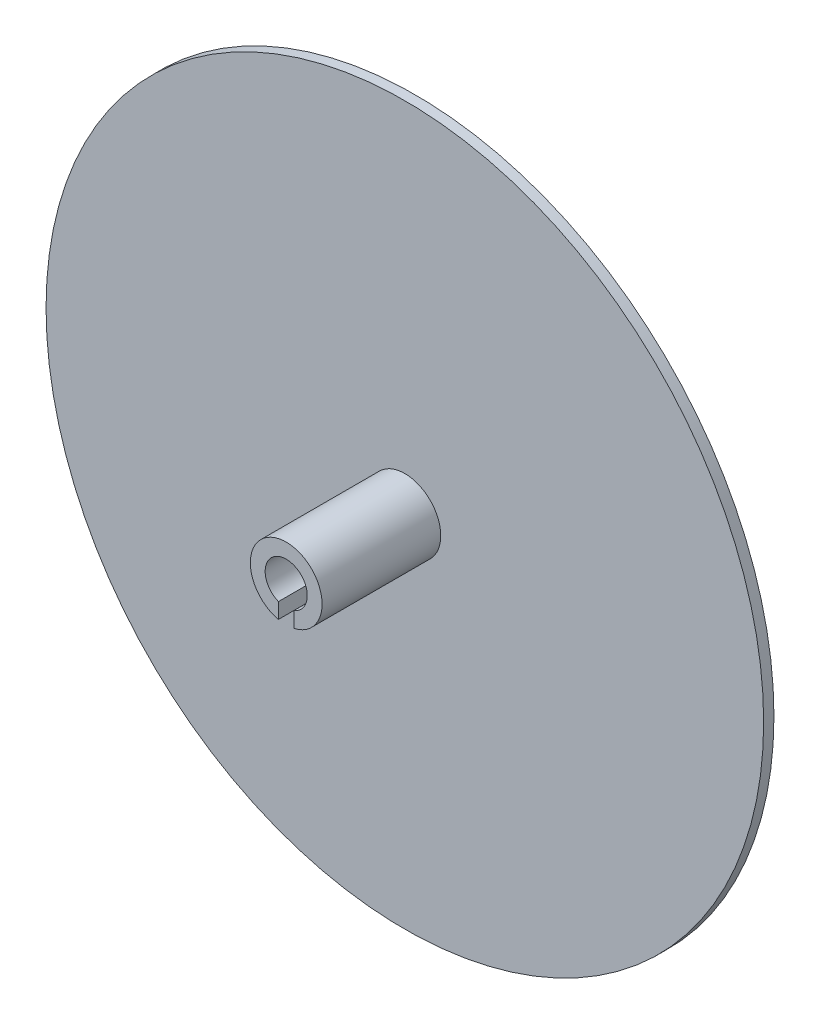
ISO-10303-21;
HEADER;
FILE_DESCRIPTION(('STEP AP214'),'2;1');
FILE_NAME('part.step','',(''),(''),'','','');
FILE_SCHEMA(('AUTOMOTIVE_DESIGN { 1 0 10303 214 1 1 1 1 }'));
ENDSEC;
DATA;
#1=APPLICATION_CONTEXT('core data for automotive mechanical design processes');
#2=APPLICATION_PROTOCOL_DEFINITION('international standard','automotive_design',2000,#1);
#3=PRODUCT_CONTEXT('',#1,'mechanical');
#4=PRODUCT('Part','Part','',(#3));
#5=PRODUCT_RELATED_PRODUCT_CATEGORY('part','',(#4));
#6=PRODUCT_DEFINITION_FORMATION('','',#4);
#7=PRODUCT_DEFINITION_CONTEXT('part definition',#1,'design');
#8=PRODUCT_DEFINITION('design','',#6,#7);
#9=PRODUCT_DEFINITION_SHAPE('','',#8);
#10=(LENGTH_UNIT() NAMED_UNIT(*) SI_UNIT(.MILLI.,.METRE.));
#11=(NAMED_UNIT(*) PLANE_ANGLE_UNIT() SI_UNIT($,.RADIAN.));
#12=(NAMED_UNIT(*) SI_UNIT($,.STERADIAN.) SOLID_ANGLE_UNIT());
#13=UNCERTAINTY_MEASURE_WITH_UNIT(LENGTH_MEASURE(1.E-05),#10,'distance_accuracy_value','');
#14=(GEOMETRIC_REPRESENTATION_CONTEXT(3) GLOBAL_UNCERTAINTY_ASSIGNED_CONTEXT((#13)) GLOBAL_UNIT_ASSIGNED_CONTEXT((#10,
#11,#12)) REPRESENTATION_CONTEXT('',''));
#15=CARTESIAN_POINT('',(0.,0.,0.));
#16=DIRECTION('',(0.,0.,1.));
#17=DIRECTION('',(1.,0.,0.));
#18=AXIS2_PLACEMENT_3D('',#15,#16,#17);
#19=CARTESIAN_POINT('',(0.,0.,53.9));
#20=DIRECTION('',(0.,0.,1.));
#21=DIRECTION('',(1.,0.,0.));
#22=AXIS2_PLACEMENT_3D('',#19,#20,#21);
#23=PLANE('',#22);
#24=CARTESIAN_POINT('',(0.,0.,53.9));
#25=DIRECTION('',(0.,0.,1.));
#26=DIRECTION('',(1.,0.,0.));
#27=AXIS2_PLACEMENT_3D('',#24,#25,#26);
#28=CIRCLE('',#27,15.);
#29=CARTESIAN_POINT('',(3.25,-14.6436846456075,53.9));
#30=VERTEX_POINT('',#29);
#31=CARTESIAN_POINT('',(-3.25,-14.6436846456075,53.9));
#32=VERTEX_POINT('',#31);
#33=EDGE_CURVE('E107',#30,#32,#28,.T.);
#34=ORIENTED_EDGE('',*,*,#33,.T.);
#35=DIRECTION('',(0.,1.,0.));
#36=VECTOR('',#35,1.);
#37=CARTESIAN_POINT('',(-3.25,0.,53.9));
#38=LINE('',#37,#36);
#39=CARTESIAN_POINT('',(-3.25,-8.17786646992967,53.9));
#40=VERTEX_POINT('',#39);
#41=EDGE_CURVE('E77',#32,#40,#38,.T.);
#42=ORIENTED_EDGE('',*,*,#41,.T.);
#43=CARTESIAN_POINT('',(0.,0.,53.9));
#44=DIRECTION('',(0.,0.,1.));
#45=DIRECTION('',(1.,0.,0.));
#46=AXIS2_PLACEMENT_3D('',#43,#44,#45);
#47=CIRCLE('',#46,8.8);
#48=CARTESIAN_POINT('',(3.25,-8.17786646992967,53.9));
#49=VERTEX_POINT('',#48);
#50=EDGE_CURVE('E99',#49,#40,#47,.T.);
#51=ORIENTED_EDGE('',*,*,#50,.F.);
#52=DIRECTION('',(0.,1.,0.));
#53=VECTOR('',#52,1.);
#54=CARTESIAN_POINT('',(3.25,0.,53.9));
#55=LINE('',#54,#53);
#56=EDGE_CURVE('E89',#30,#49,#55,.T.);
#57=ORIENTED_EDGE('',*,*,#56,.F.);
#58=EDGE_LOOP('',(#34,#42,#51,#57));
#59=FACE_BOUND('',#58,.T.);
#60=ADVANCED_FACE('F33',(#59),#23,.T.);
#61=CARTESIAN_POINT('',(0.,0.,53.9));
#62=DIRECTION('',(0.,0.,-1.));
#63=DIRECTION('',(-1.,0.,0.));
#64=AXIS2_PLACEMENT_3D('',#61,#62,#63);
#65=CYLINDRICAL_SURFACE('',#64,15.);
#66=CARTESIAN_POINT('',(0.,0.,4.3));
#67=DIRECTION('',(0.,0.,1.));
#68=DIRECTION('',(1.,0.,0.));
#69=AXIS2_PLACEMENT_3D('',#66,#67,#68);
#70=CIRCLE('',#69,15.);
#71=CARTESIAN_POINT('',(15.,0.,4.3));
#72=VERTEX_POINT('',#71);
#73=EDGE_CURVE('E106',#72,#72,#70,.T.);
#74=ORIENTED_EDGE('',*,*,#73,.T.);
#75=EDGE_LOOP('',(#74));
#76=FACE_BOUND('',#75,.T.);
#77=DIRECTION('',(0.,0.,1.));
#78=VECTOR('',#77,1.);
#79=CARTESIAN_POINT('',(-3.25,-14.6436846456075,36.65));
#80=LINE('',#79,#78);
#81=CARTESIAN_POINT('',(-3.25,-14.6436846456075,36.65));
#82=VERTEX_POINT('',#81);
#83=EDGE_CURVE('E75',#82,#32,#80,.T.);
#84=ORIENTED_EDGE('',*,*,#83,.T.);
#85=ORIENTED_EDGE('',*,*,#33,.F.);
#86=DIRECTION('',(0.,0.,1.));
#87=VECTOR('',#86,1.);
#88=CARTESIAN_POINT('',(3.25,-14.6436846456075,36.65));
#89=LINE('',#88,#87);
#90=CARTESIAN_POINT('',(3.25,-14.6436846456075,36.65));
#91=VERTEX_POINT('',#90);
#92=EDGE_CURVE('E82',#91,#30,#89,.T.);
#93=ORIENTED_EDGE('',*,*,#92,.F.);
#94=CARTESIAN_POINT('',(0.,0.,36.65));
#95=DIRECTION('',(0.,0.,1.));
#96=DIRECTION('',(1.,0.,0.));
#97=AXIS2_PLACEMENT_3D('',#94,#95,#96);
#98=CIRCLE('',#97,15.);
#99=EDGE_CURVE('E86',#82,#91,#98,.T.);
#100=ORIENTED_EDGE('',*,*,#99,.F.);
#101=EDGE_LOOP('',(#84,#85,#93,#100));
#102=FACE_BOUND('',#101,.T.);
#103=ADVANCED_FACE('F91',(#76,#102),#65,.T.);
#104=CARTESIAN_POINT('',(0.,0.,53.9));
#105=DIRECTION('',(0.,0.,-1.));
#106=DIRECTION('',(-1.,0.,0.));
#107=AXIS2_PLACEMENT_3D('',#104,#105,#106);
#108=CYLINDRICAL_SURFACE('',#107,8.8);
#109=CARTESIAN_POINT('',(0.,0.,4.3));
#110=DIRECTION('',(0.,0.,1.));
#111=DIRECTION('',(1.,0.,0.));
#112=AXIS2_PLACEMENT_3D('',#109,#110,#111);
#113=CIRCLE('',#112,8.8);
#114=CARTESIAN_POINT('',(8.8,0.,4.3));
#115=VERTEX_POINT('',#114);
#116=EDGE_CURVE('E11',#115,#115,#113,.F.);
#117=ORIENTED_EDGE('',*,*,#116,.T.);
#118=EDGE_LOOP('',(#117));
#119=FACE_BOUND('',#118,.T.);
#120=ORIENTED_EDGE('',*,*,#50,.T.);
#121=DIRECTION('',(0.,0.,1.));
#122=VECTOR('',#121,1.);
#123=CARTESIAN_POINT('',(-3.25,-8.17786646992967,36.65));
#124=LINE('',#123,#122);
#125=CARTESIAN_POINT('',(-3.25,-8.17786646992967,36.65));
#126=VERTEX_POINT('',#125);
#127=EDGE_CURVE('E72',#126,#40,#124,.T.);
#128=ORIENTED_EDGE('',*,*,#127,.F.);
#129=CARTESIAN_POINT('',(0.,0.,36.65));
#130=DIRECTION('',(0.,0.,1.));
#131=DIRECTION('',(1.,0.,0.));
#132=AXIS2_PLACEMENT_3D('',#129,#130,#131);
#133=CIRCLE('',#132,8.8);
#134=CARTESIAN_POINT('',(3.25,-8.17786646992967,36.65));
#135=VERTEX_POINT('',#134);
#136=EDGE_CURVE('E83',#135,#126,#133,.F.);
#137=ORIENTED_EDGE('',*,*,#136,.F.);
#138=DIRECTION('',(0.,0.,1.));
#139=VECTOR('',#138,1.);
#140=CARTESIAN_POINT('',(3.25,-8.17786646992967,36.65));
#141=LINE('',#140,#139);
#142=EDGE_CURVE('E100',#135,#49,#141,.T.);
#143=ORIENTED_EDGE('',*,*,#142,.T.);
#144=EDGE_LOOP('',(#120,#128,#137,#143));
#145=FACE_BOUND('',#144,.T.);
#146=ADVANCED_FACE('F134',(#119,#145),#108,.F.);
#147=CARTESIAN_POINT('',(0.,0.,4.3));
#148=DIRECTION('',(0.,0.,-1.));
#149=DIRECTION('',(-1.,0.,0.));
#150=AXIS2_PLACEMENT_3D('',#147,#148,#149);
#151=CYLINDRICAL_SURFACE('',#150,150.);
#152=CARTESIAN_POINT('',(0.,0.,4.3));
#153=DIRECTION('',(0.,0.,1.));
#154=DIRECTION('',(1.,0.,0.));
#155=AXIS2_PLACEMENT_3D('',#152,#153,#154);
#156=CIRCLE('',#155,150.);
#157=CARTESIAN_POINT('',(150.,0.,4.3));
#158=VERTEX_POINT('',#157);
#159=EDGE_CURVE('E41',#158,#158,#156,.T.);
#160=ORIENTED_EDGE('',*,*,#159,.F.);
#161=EDGE_LOOP('',(#160));
#162=FACE_BOUND('',#161,.T.);
#163=CARTESIAN_POINT('',(0.,0.,0.));
#164=DIRECTION('',(0.,0.,1.));
#165=DIRECTION('',(1.,0.,0.));
#166=AXIS2_PLACEMENT_3D('',#163,#164,#165);
#167=CIRCLE('',#166,150.);
#168=CARTESIAN_POINT('',(150.,0.,0.));
#169=VERTEX_POINT('',#168);
#170=EDGE_CURVE('E109',#169,#169,#167,.T.);
#171=ORIENTED_EDGE('',*,*,#170,.T.);
#172=EDGE_LOOP('',(#171));
#173=FACE_BOUND('',#172,.T.);
#174=ADVANCED_FACE('F35',(#162,#173),#151,.T.);
#175=CARTESIAN_POINT('',(0.,0.,4.3));
#176=DIRECTION('',(0.,0.,1.));
#177=DIRECTION('',(1.,0.,0.));
#178=AXIS2_PLACEMENT_3D('',#175,#176,#177);
#179=PLANE('',#178);
#180=ORIENTED_EDGE('',*,*,#73,.F.);
#181=EDGE_LOOP('',(#180));
#182=FACE_BOUND('',#181,.T.);
#183=ORIENTED_EDGE('',*,*,#159,.T.);
#184=EDGE_LOOP('',(#183));
#185=FACE_BOUND('',#184,.T.);
#186=ADVANCED_FACE('F120',(#182,#185),#179,.T.);
#187=CARTESIAN_POINT('',(0.,0.,0.));
#188=DIRECTION('',(0.,0.,1.));
#189=DIRECTION('',(1.,0.,0.));
#190=AXIS2_PLACEMENT_3D('',#187,#188,#189);
#191=PLANE('',#190);
#192=ORIENTED_EDGE('',*,*,#170,.F.);
#193=EDGE_LOOP('',(#192));
#194=FACE_BOUND('',#193,.T.);
#195=ADVANCED_FACE('F117',(#194),#191,.F.);
#196=ORIENTED_EDGE('',*,*,#116,.F.);
#197=EDGE_LOOP('',(#196));
#198=FACE_BOUND('',#197,.T.);
#199=ADVANCED_FACE('F119',(#198),#179,.T.);
#200=CARTESIAN_POINT('',(-3.25,0.,36.65));
#201=DIRECTION('',(1.,0.,0.));
#202=DIRECTION('',(0.,0.,-1.));
#203=AXIS2_PLACEMENT_3D('',#200,#201,#202);
#204=PLANE('',#203);
#205=ORIENTED_EDGE('',*,*,#41,.F.);
#206=ORIENTED_EDGE('',*,*,#83,.F.);
#207=DIRECTION('',(0.,1.,0.));
#208=VECTOR('',#207,1.);
#209=CARTESIAN_POINT('',(-3.25,0.,36.65));
#210=LINE('',#209,#208);
#211=EDGE_CURVE('E57',#82,#126,#210,.T.);
#212=ORIENTED_EDGE('',*,*,#211,.T.);
#213=ORIENTED_EDGE('',*,*,#127,.T.);
#214=EDGE_LOOP('',(#205,#206,#212,#213));
#215=FACE_BOUND('',#214,.T.);
#216=ADVANCED_FACE('F76',(#215),#204,.T.);
#217=CARTESIAN_POINT('',(3.25,0.,36.65));
#218=DIRECTION('',(1.,0.,0.));
#219=DIRECTION('',(0.,0.,-1.));
#220=AXIS2_PLACEMENT_3D('',#217,#218,#219);
#221=PLANE('',#220);
#222=ORIENTED_EDGE('',*,*,#56,.T.);
#223=ORIENTED_EDGE('',*,*,#142,.F.);
#224=DIRECTION('',(0.,1.,0.));
#225=VECTOR('',#224,1.);
#226=CARTESIAN_POINT('',(3.25,0.,36.65));
#227=LINE('',#226,#225);
#228=EDGE_CURVE('E48',#91,#135,#227,.T.);
#229=ORIENTED_EDGE('',*,*,#228,.F.);
#230=ORIENTED_EDGE('',*,*,#92,.T.);
#231=EDGE_LOOP('',(#222,#223,#229,#230));
#232=FACE_BOUND('',#231,.T.);
#233=ADVANCED_FACE('F143',(#232),#221,.F.);
#234=CARTESIAN_POINT('',(0.,0.,36.65));
#235=DIRECTION('',(0.,0.,1.));
#236=DIRECTION('',(1.,0.,0.));
#237=AXIS2_PLACEMENT_3D('',#234,#235,#236);
#238=PLANE('',#237);
#239=ORIENTED_EDGE('',*,*,#211,.F.);
#240=ORIENTED_EDGE('',*,*,#99,.T.);
#241=ORIENTED_EDGE('',*,*,#228,.T.);
#242=ORIENTED_EDGE('',*,*,#136,.T.);
#243=EDGE_LOOP('',(#239,#240,#241,#242));
#244=FACE_BOUND('',#243,.T.);
#245=ADVANCED_FACE('F85',(#244),#238,.T.);
#246=CLOSED_SHELL('',(#60,#103,#146,#174,#186,#195,#199,#216,#233,#245));
#247=MANIFOLD_SOLID_BREP('B2',#246);
#248=ADVANCED_BREP_SHAPE_REPRESENTATION('',(#18,#247),#14);
#249=SHAPE_DEFINITION_REPRESENTATION(#9,#248);
ENDSEC;
END-ISO-10303-21;
